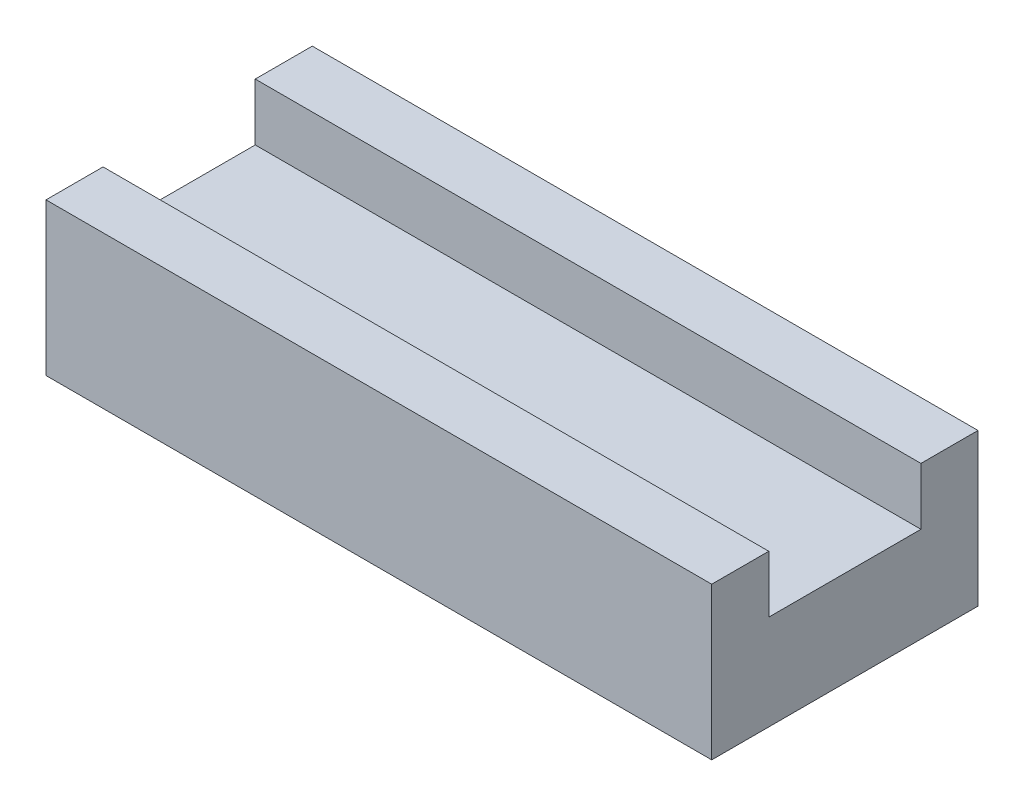
ISO-10303-21;
HEADER;
FILE_DESCRIPTION(('STEP AP214'),'2;1');
FILE_NAME('part.step','',(''),(''),'','','');
FILE_SCHEMA(('AUTOMOTIVE_DESIGN { 1 0 10303 214 1 1 1 1 }'));
ENDSEC;
DATA;
#1=APPLICATION_CONTEXT('core data for automotive mechanical design processes');
#2=APPLICATION_PROTOCOL_DEFINITION('international standard','automotive_design',2000,#1);
#3=PRODUCT_CONTEXT('',#1,'mechanical');
#4=PRODUCT('Part','Part','',(#3));
#5=PRODUCT_RELATED_PRODUCT_CATEGORY('part','',(#4));
#6=PRODUCT_DEFINITION_FORMATION('','',#4);
#7=PRODUCT_DEFINITION_CONTEXT('part definition',#1,'design');
#8=PRODUCT_DEFINITION('design','',#6,#7);
#9=PRODUCT_DEFINITION_SHAPE('','',#8);
#10=(LENGTH_UNIT() NAMED_UNIT(*) SI_UNIT(.MILLI.,.METRE.));
#11=(NAMED_UNIT(*) PLANE_ANGLE_UNIT() SI_UNIT($,.RADIAN.));
#12=(NAMED_UNIT(*) SI_UNIT($,.STERADIAN.) SOLID_ANGLE_UNIT());
#13=UNCERTAINTY_MEASURE_WITH_UNIT(LENGTH_MEASURE(1.E-05),#10,'distance_accuracy_value','');
#14=(GEOMETRIC_REPRESENTATION_CONTEXT(3) GLOBAL_UNCERTAINTY_ASSIGNED_CONTEXT((#13)) GLOBAL_UNIT_ASSIGNED_CONTEXT((#10,
#11,#12)) REPRESENTATION_CONTEXT('',''));
#15=CARTESIAN_POINT('',(0.,0.,0.));
#16=DIRECTION('',(0.,0.,1.));
#17=DIRECTION('',(1.,0.,0.));
#18=AXIS2_PLACEMENT_3D('',#15,#16,#17);
#19=CARTESIAN_POINT('',(-35.,-2.5,-7.));
#20=DIRECTION('',(0.,0.,-1.));
#21=DIRECTION('',(0.,1.,0.));
#22=AXIS2_PLACEMENT_3D('',#19,#20,#21);
#23=PLANE('',#22);
#24=DIRECTION('',(0.,1.,0.));
#25=VECTOR('',#24,1.);
#26=CARTESIAN_POINT('',(0.,-2.5,-7.));
#27=LINE('',#26,#25);
#28=CARTESIAN_POINT('',(0.,-2.5,-7.));
#29=VERTEX_POINT('',#28);
#30=CARTESIAN_POINT('',(0.,5.5,-7.));
#31=VERTEX_POINT('',#30);
#32=EDGE_CURVE('E153',#29,#31,#27,.T.);
#33=ORIENTED_EDGE('',*,*,#32,.F.);
#34=DIRECTION('',(1.,0.,0.));
#35=VECTOR('',#34,1.);
#36=CARTESIAN_POINT('',(-35.,-2.5,-7.));
#37=LINE('',#36,#35);
#38=CARTESIAN_POINT('',(-35.,-2.5,-7.));
#39=VERTEX_POINT('',#38);
#40=EDGE_CURVE('E11',#39,#29,#37,.T.);
#41=ORIENTED_EDGE('',*,*,#40,.F.);
#42=DIRECTION('',(0.,1.,0.));
#43=VECTOR('',#42,1.);
#44=CARTESIAN_POINT('',(-35.,2.5,-7.));
#45=LINE('',#44,#43);
#46=CARTESIAN_POINT('',(-35.,5.5,-7.));
#47=VERTEX_POINT('',#46);
#48=EDGE_CURVE('E56',#39,#47,#45,.T.);
#49=ORIENTED_EDGE('',*,*,#48,.T.);
#50=DIRECTION('',(1.,0.,0.));
#51=VECTOR('',#50,1.);
#52=CARTESIAN_POINT('',(-35.,5.5,-7.));
#53=LINE('',#52,#51);
#54=EDGE_CURVE('E41',#47,#31,#53,.T.);
#55=ORIENTED_EDGE('',*,*,#54,.T.);
#56=EDGE_LOOP('',(#33,#41,#49,#55));
#57=FACE_BOUND('',#56,.T.);
#58=ADVANCED_FACE('F37',(#57),#23,.T.);
#59=CARTESIAN_POINT('',(-35.,-2.5,7.));
#60=DIRECTION('',(0.,-1.,0.));
#61=DIRECTION('',(0.,0.,-1.));
#62=AXIS2_PLACEMENT_3D('',#59,#60,#61);
#63=PLANE('',#62);
#64=DIRECTION('',(0.,0.,-1.));
#65=VECTOR('',#64,1.);
#66=CARTESIAN_POINT('',(0.,-2.5,7.));
#67=LINE('',#66,#65);
#68=CARTESIAN_POINT('',(0.,-2.5,7.));
#69=VERTEX_POINT('',#68);
#70=EDGE_CURVE('E151',#69,#29,#67,.T.);
#71=ORIENTED_EDGE('',*,*,#70,.F.);
#72=DIRECTION('',(1.,0.,0.));
#73=VECTOR('',#72,1.);
#74=CARTESIAN_POINT('',(-35.,-2.5,7.));
#75=LINE('',#74,#73);
#76=CARTESIAN_POINT('',(-35.,-2.5,7.));
#77=VERTEX_POINT('',#76);
#78=EDGE_CURVE('E47',#77,#69,#75,.T.);
#79=ORIENTED_EDGE('',*,*,#78,.F.);
#80=DIRECTION('',(0.,0.,-1.));
#81=VECTOR('',#80,1.);
#82=CARTESIAN_POINT('',(-35.,-2.5,7.));
#83=LINE('',#82,#81);
#84=EDGE_CURVE('E126',#77,#39,#83,.T.);
#85=ORIENTED_EDGE('',*,*,#84,.T.);
#86=ORIENTED_EDGE('',*,*,#40,.T.);
#87=EDGE_LOOP('',(#71,#79,#85,#86));
#88=FACE_BOUND('',#87,.T.);
#89=ADVANCED_FACE('F166',(#88),#63,.T.);
#90=CARTESIAN_POINT('',(-35.,-2.5,7.));
#91=DIRECTION('',(0.,0.,1.));
#92=DIRECTION('',(0.,-1.,0.));
#93=AXIS2_PLACEMENT_3D('',#90,#91,#92);
#94=PLANE('',#93);
#95=DIRECTION('',(0.,-1.,0.));
#96=VECTOR('',#95,1.);
#97=CARTESIAN_POINT('',(0.,-2.5,7.));
#98=LINE('',#97,#96);
#99=CARTESIAN_POINT('',(0.,5.5,7.));
#100=VERTEX_POINT('',#99);
#101=EDGE_CURVE('E114',#100,#69,#98,.T.);
#102=ORIENTED_EDGE('',*,*,#101,.F.);
#103=DIRECTION('',(1.,0.,0.));
#104=VECTOR('',#103,1.);
#105=CARTESIAN_POINT('',(-35.,5.5,7.));
#106=LINE('',#105,#104);
#107=CARTESIAN_POINT('',(-35.,5.5,7.));
#108=VERTEX_POINT('',#107);
#109=EDGE_CURVE('E109',#108,#100,#106,.T.);
#110=ORIENTED_EDGE('',*,*,#109,.F.);
#111=DIRECTION('',(0.,-1.,0.));
#112=VECTOR('',#111,1.);
#113=CARTESIAN_POINT('',(-35.,2.5,7.));
#114=LINE('',#113,#112);
#115=EDGE_CURVE('E112',#108,#77,#114,.T.);
#116=ORIENTED_EDGE('',*,*,#115,.T.);
#117=ORIENTED_EDGE('',*,*,#78,.T.);
#118=EDGE_LOOP('',(#102,#110,#116,#117));
#119=FACE_BOUND('',#118,.T.);
#120=ADVANCED_FACE('F111',(#119),#94,.T.);
#121=CARTESIAN_POINT('',(-35.,5.5,7.));
#122=DIRECTION('',(0.,1.,0.));
#123=DIRECTION('',(0.,0.,1.));
#124=AXIS2_PLACEMENT_3D('',#121,#122,#123);
#125=PLANE('',#124);
#126=DIRECTION('',(0.,0.,1.));
#127=VECTOR('',#126,1.);
#128=CARTESIAN_POINT('',(0.,5.5,7.));
#129=LINE('',#128,#127);
#130=CARTESIAN_POINT('',(0.,5.5,4.));
#131=VERTEX_POINT('',#130);
#132=EDGE_CURVE('E148',#131,#100,#129,.T.);
#133=ORIENTED_EDGE('',*,*,#132,.F.);
#134=DIRECTION('',(1.,0.,0.));
#135=VECTOR('',#134,1.);
#136=CARTESIAN_POINT('',(-35.,5.5,4.));
#137=LINE('',#136,#135);
#138=CARTESIAN_POINT('',(-35.,5.5,4.));
#139=VERTEX_POINT('',#138);
#140=EDGE_CURVE('E119',#139,#131,#137,.T.);
#141=ORIENTED_EDGE('',*,*,#140,.F.);
#142=DIRECTION('',(0.,0.,1.));
#143=VECTOR('',#142,1.);
#144=CARTESIAN_POINT('',(-35.,5.5,7.));
#145=LINE('',#144,#143);
#146=EDGE_CURVE('E124',#139,#108,#145,.T.);
#147=ORIENTED_EDGE('',*,*,#146,.T.);
#148=ORIENTED_EDGE('',*,*,#109,.T.);
#149=EDGE_LOOP('',(#133,#141,#147,#148));
#150=FACE_BOUND('',#149,.T.);
#151=ADVANCED_FACE('F128',(#150),#125,.T.);
#152=CARTESIAN_POINT('',(-35.,5.5,4.));
#153=DIRECTION('',(0.,0.,-1.));
#154=DIRECTION('',(0.,1.,0.));
#155=AXIS2_PLACEMENT_3D('',#152,#153,#154);
#156=PLANE('',#155);
#157=DIRECTION('',(0.,1.,0.));
#158=VECTOR('',#157,1.);
#159=CARTESIAN_POINT('',(0.,5.5,4.));
#160=LINE('',#159,#158);
#161=CARTESIAN_POINT('',(0.,2.5,4.));
#162=VERTEX_POINT('',#161);
#163=EDGE_CURVE('E145',#162,#131,#160,.T.);
#164=ORIENTED_EDGE('',*,*,#163,.F.);
#165=DIRECTION('',(1.,0.,0.));
#166=VECTOR('',#165,1.);
#167=CARTESIAN_POINT('',(-35.,2.5,4.));
#168=LINE('',#167,#166);
#169=CARTESIAN_POINT('',(-35.,2.5,4.));
#170=VERTEX_POINT('',#169);
#171=EDGE_CURVE('E157',#170,#162,#168,.T.);
#172=ORIENTED_EDGE('',*,*,#171,.F.);
#173=DIRECTION('',(0.,1.,0.));
#174=VECTOR('',#173,1.);
#175=CARTESIAN_POINT('',(-35.,5.5,4.));
#176=LINE('',#175,#174);
#177=EDGE_CURVE('E129',#170,#139,#176,.T.);
#178=ORIENTED_EDGE('',*,*,#177,.T.);
#179=ORIENTED_EDGE('',*,*,#140,.T.);
#180=EDGE_LOOP('',(#164,#172,#178,#179));
#181=FACE_BOUND('',#180,.T.);
#182=ADVANCED_FACE('F179',(#181),#156,.T.);
#183=CARTESIAN_POINT('',(-35.,2.5,4.));
#184=DIRECTION('',(0.,1.,0.));
#185=DIRECTION('',(0.,0.,1.));
#186=AXIS2_PLACEMENT_3D('',#183,#184,#185);
#187=PLANE('',#186);
#188=DIRECTION('',(0.,0.,1.));
#189=VECTOR('',#188,1.);
#190=CARTESIAN_POINT('',(0.,2.5,4.));
#191=LINE('',#190,#189);
#192=CARTESIAN_POINT('',(0.,2.5,-4.));
#193=VERTEX_POINT('',#192);
#194=EDGE_CURVE('E142',#193,#162,#191,.T.);
#195=ORIENTED_EDGE('',*,*,#194,.F.);
#196=DIRECTION('',(1.,0.,0.));
#197=VECTOR('',#196,1.);
#198=CARTESIAN_POINT('',(-35.,2.5,-4.));
#199=LINE('',#198,#197);
#200=CARTESIAN_POINT('',(-35.,2.5,-4.));
#201=VERTEX_POINT('',#200);
#202=EDGE_CURVE('E159',#201,#193,#199,.T.);
#203=ORIENTED_EDGE('',*,*,#202,.F.);
#204=DIRECTION('',(0.,0.,1.));
#205=VECTOR('',#204,1.);
#206=CARTESIAN_POINT('',(-35.,2.5,4.));
#207=LINE('',#206,#205);
#208=EDGE_CURVE('E131',#201,#170,#207,.T.);
#209=ORIENTED_EDGE('',*,*,#208,.T.);
#210=ORIENTED_EDGE('',*,*,#171,.T.);
#211=EDGE_LOOP('',(#195,#203,#209,#210));
#212=FACE_BOUND('',#211,.T.);
#213=ADVANCED_FACE('F182',(#212),#187,.T.);
#214=CARTESIAN_POINT('',(-35.,5.5,-4.));
#215=DIRECTION('',(0.,0.,1.));
#216=DIRECTION('',(0.,-1.,0.));
#217=AXIS2_PLACEMENT_3D('',#214,#215,#216);
#218=PLANE('',#217);
#219=DIRECTION('',(0.,-1.,0.));
#220=VECTOR('',#219,1.);
#221=CARTESIAN_POINT('',(0.,5.5,-4.));
#222=LINE('',#221,#220);
#223=CARTESIAN_POINT('',(0.,5.5,-4.));
#224=VERTEX_POINT('',#223);
#225=EDGE_CURVE('E139',#224,#193,#222,.T.);
#226=ORIENTED_EDGE('',*,*,#225,.F.);
#227=DIRECTION('',(1.,0.,0.));
#228=VECTOR('',#227,1.);
#229=CARTESIAN_POINT('',(-35.,5.5,-4.));
#230=LINE('',#229,#228);
#231=CARTESIAN_POINT('',(-35.,5.5,-4.));
#232=VERTEX_POINT('',#231);
#233=EDGE_CURVE('E160',#232,#224,#230,.T.);
#234=ORIENTED_EDGE('',*,*,#233,.F.);
#235=DIRECTION('',(0.,-1.,0.));
#236=VECTOR('',#235,1.);
#237=CARTESIAN_POINT('',(-35.,5.5,-4.));
#238=LINE('',#237,#236);
#239=EDGE_CURVE('E195',#232,#201,#238,.T.);
#240=ORIENTED_EDGE('',*,*,#239,.T.);
#241=ORIENTED_EDGE('',*,*,#202,.T.);
#242=EDGE_LOOP('',(#226,#234,#240,#241));
#243=FACE_BOUND('',#242,.T.);
#244=ADVANCED_FACE('F185',(#243),#218,.T.);
#245=CARTESIAN_POINT('',(-35.,5.5,-7.));
#246=DIRECTION('',(0.,1.,0.));
#247=DIRECTION('',(0.,0.,1.));
#248=AXIS2_PLACEMENT_3D('',#245,#246,#247);
#249=PLANE('',#248);
#250=DIRECTION('',(0.,0.,1.));
#251=VECTOR('',#250,1.);
#252=CARTESIAN_POINT('',(0.,5.5,-7.));
#253=LINE('',#252,#251);
#254=EDGE_CURVE('E136',#31,#224,#253,.T.);
#255=ORIENTED_EDGE('',*,*,#254,.F.);
#256=ORIENTED_EDGE('',*,*,#54,.F.);
#257=DIRECTION('',(0.,0.,1.));
#258=VECTOR('',#257,1.);
#259=CARTESIAN_POINT('',(-35.,5.5,-7.));
#260=LINE('',#259,#258);
#261=EDGE_CURVE('E199',#47,#232,#260,.T.);
#262=ORIENTED_EDGE('',*,*,#261,.T.);
#263=ORIENTED_EDGE('',*,*,#233,.T.);
#264=EDGE_LOOP('',(#255,#256,#262,#263));
#265=FACE_BOUND('',#264,.T.);
#266=ADVANCED_FACE('F39',(#265),#249,.T.);
#267=CARTESIAN_POINT('',(-35.,0.,0.));
#268=DIRECTION('',(1.,0.,0.));
#269=DIRECTION('',(0.,0.,-1.));
#270=AXIS2_PLACEMENT_3D('',#267,#268,#269);
#271=PLANE('',#270);
#272=ORIENTED_EDGE('',*,*,#48,.F.);
#273=ORIENTED_EDGE('',*,*,#84,.F.);
#274=ORIENTED_EDGE('',*,*,#115,.F.);
#275=ORIENTED_EDGE('',*,*,#146,.F.);
#276=ORIENTED_EDGE('',*,*,#177,.F.);
#277=ORIENTED_EDGE('',*,*,#208,.F.);
#278=ORIENTED_EDGE('',*,*,#239,.F.);
#279=ORIENTED_EDGE('',*,*,#261,.F.);
#280=EDGE_LOOP('',(#272,#273,#274,#275,#276,#277,#278,#279));
#281=FACE_BOUND('',#280,.T.);
#282=ADVANCED_FACE('F122',(#281),#271,.F.);
#283=CARTESIAN_POINT('',(0.,0.,0.));
#284=DIRECTION('',(1.,0.,0.));
#285=DIRECTION('',(0.,0.,-1.));
#286=AXIS2_PLACEMENT_3D('',#283,#284,#285);
#287=PLANE('',#286);
#288=ORIENTED_EDGE('',*,*,#32,.T.);
#289=ORIENTED_EDGE('',*,*,#254,.T.);
#290=ORIENTED_EDGE('',*,*,#225,.T.);
#291=ORIENTED_EDGE('',*,*,#194,.T.);
#292=ORIENTED_EDGE('',*,*,#163,.T.);
#293=ORIENTED_EDGE('',*,*,#132,.T.);
#294=ORIENTED_EDGE('',*,*,#101,.T.);
#295=ORIENTED_EDGE('',*,*,#70,.T.);
#296=EDGE_LOOP('',(#288,#289,#290,#291,#292,#293,#294,#295));
#297=FACE_BOUND('',#296,.T.);
#298=ADVANCED_FACE('F165',(#297),#287,.T.);
#299=CLOSED_SHELL('',(#58,#89,#120,#151,#182,#213,#244,#266,#282,#298));
#300=MANIFOLD_SOLID_BREP('B2',#299);
#301=ADVANCED_BREP_SHAPE_REPRESENTATION('',(#18,#300),#14);
#302=SHAPE_DEFINITION_REPRESENTATION(#9,#301);
ENDSEC;
END-ISO-10303-21;
